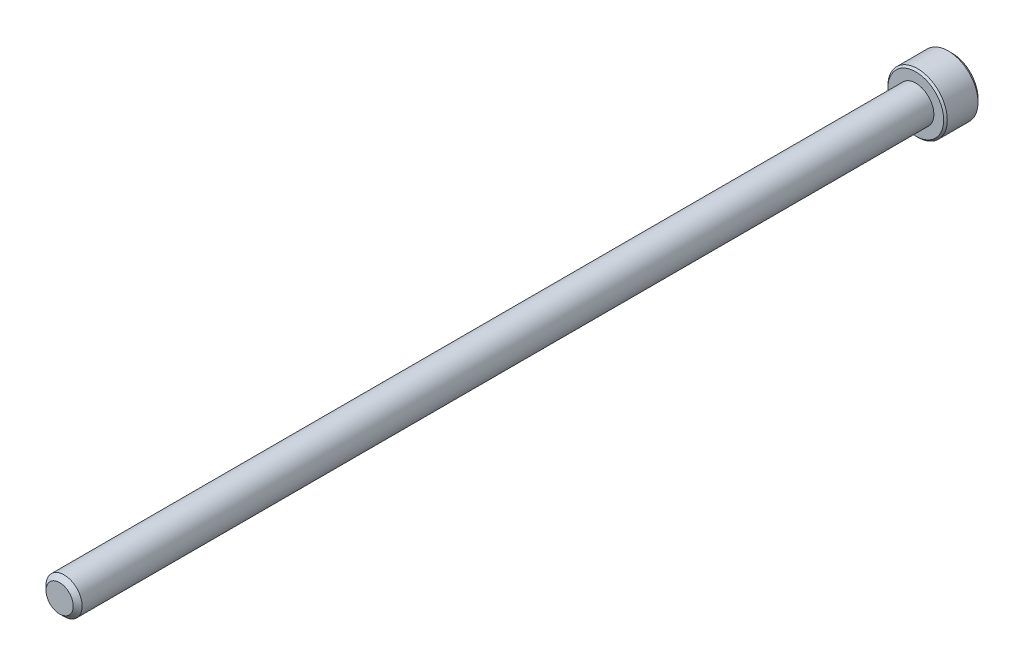
ISO-10303-21;
HEADER;
FILE_DESCRIPTION(('STEP AP214'),'2;1');
FILE_NAME('part.step','',(''),(''),'','','');
FILE_SCHEMA(('AUTOMOTIVE_DESIGN { 1 0 10303 214 1 1 1 1 }'));
ENDSEC;
DATA;
#1=APPLICATION_CONTEXT('core data for automotive mechanical design processes');
#2=APPLICATION_PROTOCOL_DEFINITION('international standard','automotive_design',2000,#1);
#3=PRODUCT_CONTEXT('',#1,'mechanical');
#4=PRODUCT('Part','Part','',(#3));
#5=PRODUCT_RELATED_PRODUCT_CATEGORY('part','',(#4));
#6=PRODUCT_DEFINITION_FORMATION('','',#4);
#7=PRODUCT_DEFINITION_CONTEXT('part definition',#1,'design');
#8=PRODUCT_DEFINITION('design','',#6,#7);
#9=PRODUCT_DEFINITION_SHAPE('','',#8);
#10=(LENGTH_UNIT() NAMED_UNIT(*) SI_UNIT(.MILLI.,.METRE.));
#11=(NAMED_UNIT(*) PLANE_ANGLE_UNIT() SI_UNIT($,.RADIAN.));
#12=(NAMED_UNIT(*) SI_UNIT($,.STERADIAN.) SOLID_ANGLE_UNIT());
#13=UNCERTAINTY_MEASURE_WITH_UNIT(LENGTH_MEASURE(1.E-05),#10,'distance_accuracy_value','');
#14=(GEOMETRIC_REPRESENTATION_CONTEXT(3) GLOBAL_UNCERTAINTY_ASSIGNED_CONTEXT((#13)) GLOBAL_UNIT_ASSIGNED_CONTEXT((#10,
#11,#12)) REPRESENTATION_CONTEXT('',''));
#15=CARTESIAN_POINT('',(0.,0.,0.));
#16=DIRECTION('',(0.,0.,1.));
#17=DIRECTION('',(1.,0.,0.));
#18=AXIS2_PLACEMENT_3D('',#15,#16,#17);
#19=CARTESIAN_POINT('',(-1.984375,-1.14567944042316,-116.1494375));
#20=DIRECTION('',(-1.,0.,0.));
#21=DIRECTION('',(0.,-1.,0.));
#22=AXIS2_PLACEMENT_3D('',#19,#20,#21);
#23=PLANE('',#22);
#24=CARTESIAN_POINT('',(-1.984375,1.14567944041338,-119.126000000011));
#25=CARTESIAN_POINT('',(-1.98437500000024,1.0674388034124,-119.086916183681));
#26=CARTESIAN_POINT('',(-1.98437500000012,0.987898318953982,-119.050114476903));
#27=CARTESIAN_POINT('',(-1.98437499999988,0.825677042049242,-118.982656205058));
#28=CARTESIAN_POINT('',(-1.98437499999976,0.742979382563747,-118.952040560663));
#29=CARTESIAN_POINT('',(-1.98437500000024,0.575193959619517,-118.899173922878));
#30=CARTESIAN_POINT('',(-1.98437500000084,0.490115359195776,-118.876894620852));
#31=CARTESIAN_POINT('',(-1.98437499999917,0.318093091238021,-118.842594672255));
#32=CARTESIAN_POINT('',(-1.98437499999691,0.231156055098932,-118.830542302321));
#33=CARTESIAN_POINT('',(-1.98437500000085,0.119918521624664,-118.822491102659));
#34=CARTESIAN_POINT('',(-1.9843750000021,0.0959468443956495,-118.821189475593));
#35=CARTESIAN_POINT('',(-1.9843749999979,0.0479845644867519,-118.819451826315));
#36=CARTESIAN_POINT('',(-1.98437499999245,0.0239939791817175,-118.81901533388));
#37=CARTESIAN_POINT('',(-1.98437499998354,-0.0602201717362284,-118.819018090105));
#38=CARTESIAN_POINT('',(-1.98437499999549,-0.120461721886413,-118.821774523015));
#39=CARTESIAN_POINT('',(-1.98437500000451,-0.240474970950748,-118.83263655126));
#40=CARTESIAN_POINT('',(-1.98437500000157,-0.300246312710092,-118.840745877508));
#41=CARTESIAN_POINT('',(-1.98437499999685,-0.478763752726255,-118.872596229478));
#42=CARTESIAN_POINT('',(-1.98437499999927,-0.596208828840069,-118.90385422612));
#43=CARTESIAN_POINT('',(-1.98437500000048,-0.78592148733947,-118.967800035926));
#44=CARTESIAN_POINT('',(-1.98437500000024,-0.859734609779649,-118.996234577698));
#45=CARTESIAN_POINT('',(-1.98437499999977,-1.00456595513328,-119.05786140404));
#46=CARTESIAN_POINT('',(-1.98437499999953,-1.07560356652465,-119.091007793046));
#47=CARTESIAN_POINT('',(-1.984375,-1.14567944041337,-119.126000000011));
#48=B_SPLINE_CURVE_WITH_KNOTS('',3,(#24,#25,#26,#27,#28,#29,#30,#31,#32,#33,#34,#35,#36,#37,#38,
#39,#40,#41,#42,#43,#44,#45,#46,#47),.UNSPECIFIED.,.F.,.F.,(4,2,2,2,2,2,2,2,2,2,2,4),(0.,
0.26255900517064,0.526801735763274,0.790138824289467,1.05265603846137,1.1246661917328,
1.1966371949705,1.37727026721659,1.55802937201545,1.92104085076478,2.15819130083342,
2.39317265074609),.UNSPECIFIED.);
#49=CARTESIAN_POINT('',(-1.98437499999081,1.14567944041786,-119.126000000005));
#50=VERTEX_POINT('',#49);
#51=CARTESIAN_POINT('',(-1.98437499999081,-1.14567944041786,-119.126000000005));
#52=VERTEX_POINT('',#51);
#53=EDGE_CURVE('E21',#50,#52,#48,.T.);
#54=ORIENTED_EDGE('',*,*,#53,.F.);
#55=DIRECTION('',(0.,0.,1.));
#56=VECTOR('',#55,1.);
#57=CARTESIAN_POINT('',(-1.984375,1.14567944042316,-116.1494375));
#58=LINE('',#57,#56);
#59=CARTESIAN_POINT('',(-1.984375,1.14567944042316,-116.1494375));
#60=VERTEX_POINT('',#59);
#61=EDGE_CURVE('E65',#50,#60,#58,.T.);
#62=ORIENTED_EDGE('',*,*,#61,.T.);
#63=DIRECTION('',(0.,1.,0.));
#64=VECTOR('',#63,1.);
#65=CARTESIAN_POINT('',(-1.984375,3.43703832126949,-116.1494375));
#66=LINE('',#65,#64);
#67=CARTESIAN_POINT('',(-1.984375,-1.14567944042316,-116.1494375));
#68=VERTEX_POINT('',#67);
#69=EDGE_CURVE('E70',#68,#60,#66,.T.);
#70=ORIENTED_EDGE('',*,*,#69,.F.);
#71=DIRECTION('',(0.,0.,1.));
#72=VECTOR('',#71,1.);
#73=CARTESIAN_POINT('',(-1.984375,-1.14567944042316,-116.1494375));
#74=LINE('',#73,#72);
#75=EDGE_CURVE('E68',#68,#52,#74,.F.);
#76=ORIENTED_EDGE('',*,*,#75,.T.);
#77=EDGE_LOOP('',(#54,#62,#70,#76));
#78=FACE_BOUND('',#77,.T.);
#79=ADVANCED_FACE('F17',(#78),#23,.F.);
#80=CARTESIAN_POINT('',(1.984375,3.43703832126949,-116.1494375));
#81=DIRECTION('',(0.,0.,-1.));
#82=DIRECTION('',(-1.,0.,0.));
#83=AXIS2_PLACEMENT_3D('',#80,#81,#82);
#84=PLANE('',#83);
#85=DIRECTION('',(0.866025403784439,-0.5,0.));
#86=VECTOR('',#85,1.);
#87=CARTESIAN_POINT('',(0.,-2.29135888084633,-116.1494375));
#88=LINE('',#87,#86);
#89=CARTESIAN_POINT('',(0.,-2.29135888084633,-116.1494375));
#90=VERTEX_POINT('',#89);
#91=EDGE_CURVE('E88',#90,#68,#88,.F.);
#92=ORIENTED_EDGE('',*,*,#91,.T.);
#93=ORIENTED_EDGE('',*,*,#69,.T.);
#94=DIRECTION('',(-0.866025403784439,-0.5,0.));
#95=VECTOR('',#94,1.);
#96=CARTESIAN_POINT('',(-1.984375,1.14567944042316,-116.1494375));
#97=LINE('',#96,#95);
#98=CARTESIAN_POINT('',(0.,2.29135888084633,-116.1494375));
#99=VERTEX_POINT('',#98);
#100=EDGE_CURVE('E87',#60,#99,#97,.F.);
#101=ORIENTED_EDGE('',*,*,#100,.T.);
#102=DIRECTION('',(-0.866025403784439,0.5,0.));
#103=VECTOR('',#102,1.);
#104=CARTESIAN_POINT('',(0.,2.29135888084633,-116.1494375));
#105=LINE('',#104,#103);
#106=CARTESIAN_POINT('',(1.984375,1.14567944042316,-116.1494375));
#107=VERTEX_POINT('',#106);
#108=EDGE_CURVE('E228',#99,#107,#105,.F.);
#109=ORIENTED_EDGE('',*,*,#108,.T.);
#110=DIRECTION('',(0.,1.,0.));
#111=VECTOR('',#110,1.);
#112=CARTESIAN_POINT('',(1.984375,1.14567944042316,-116.1494375));
#113=LINE('',#112,#111);
#114=CARTESIAN_POINT('',(1.984375,-1.14567944042316,-116.1494375));
#115=VERTEX_POINT('',#114);
#116=EDGE_CURVE('E233',#107,#115,#113,.F.);
#117=ORIENTED_EDGE('',*,*,#116,.T.);
#118=DIRECTION('',(0.866025403784439,0.5,0.));
#119=VECTOR('',#118,1.);
#120=CARTESIAN_POINT('',(1.984375,-1.14567944042316,-116.1494375));
#121=LINE('',#120,#119);
#122=EDGE_CURVE('E238',#115,#90,#121,.F.);
#123=ORIENTED_EDGE('',*,*,#122,.T.);
#124=EDGE_LOOP('',(#92,#93,#101,#109,#117,#123));
#125=FACE_BOUND('',#124,.T.);
#126=ADVANCED_FACE('F164',(#125),#84,.T.);
#127=CARTESIAN_POINT('',(-1.984375,1.14567944042316,-116.1494375));
#128=DIRECTION('',(-0.5,0.866025403784439,0.));
#129=DIRECTION('',(-0.866025403784439,-0.5,0.));
#130=AXIS2_PLACEMENT_3D('',#127,#128,#129);
#131=PLANE('',#130);
#132=CARTESIAN_POINT('',(-1.98437499999152,1.14567944042806,-119.126000000011));
#133=CARTESIAN_POINT('',(-1.91617106211821,1.18505700231901,-119.086660227985));
#134=CARTESIAN_POINT('',(-1.8468267530037,1.22509295785304,-119.049631328498));
#135=CARTESIAN_POINT('',(-1.70542659044986,1.30673037976695,-118.981832994311));
#136=CARTESIAN_POINT('',(-1.63335729719551,1.34833960562766,-118.951101270255));
#137=CARTESIAN_POINT('',(-1.48803310241476,1.43224256860409,-118.898457620171));
#138=CARTESIAN_POINT('',(-1.41481519063102,1.47451494968193,-118.876413412026));
#139=CARTESIAN_POINT('',(-1.26676792252624,1.55999007977502,-118.842450110744));
#140=CARTESIAN_POINT('',(-1.19194308558497,1.60319021952513,-118.83050567479));
#141=CARTESIAN_POINT('',(-1.0629790320441,1.67764765055274,-118.819728427594));
#142=CARTESIAN_POINT('',(-1.00900630840282,1.70880881707593,-118.818133528019));
#143=CARTESIAN_POINT('',(-0.901149169207102,1.7710801654246,-118.820823921458));
#144=CARTESIAN_POINT('',(-0.84726479123212,1.80219032555357,-118.825111275531));
#145=CARTESIAN_POINT('',(-0.74000492018226,1.86411684097745,-118.839322194288));
#146=CARTESIAN_POINT('',(-0.686630064022277,1.89493282854938,-118.84925206053));
#147=CARTESIAN_POINT('',(-0.580803363121271,1.95603190280202,-118.87420294852));
#148=CARTESIAN_POINT('',(-0.528351447917159,1.98631503016463,-118.889223579817));
#149=CARTESIAN_POINT('',(-0.394030915896095,2.06386502548468,-118.933804789076));
#150=CARTESIAN_POINT('',(-0.312994309049164,2.11065153226197,-118.96672213391));
#151=CARTESIAN_POINT('',(-0.193836207793494,2.17944749409806,-119.022289520453));
#152=CARTESIAN_POINT('',(-0.154568167005747,2.20211890801741,-119.041813093821));
#153=CARTESIAN_POINT('',(-0.0767591723958253,2.24704195200082,-119.082639700717));
#154=CARTESIAN_POINT('',(-0.0382177904819875,2.26929382922372,-119.103941643687));
#155=CARTESIAN_POINT('',(-9.51631212581947E-12,2.29135888084083,-119.12600000001));
#156=B_SPLINE_CURVE_WITH_KNOTS('',3,(#132,#133,#134,#135,#136,#137,#138,#139,#140,#141,#142,
#143,#144,#145,#146,#147,#148,#149,#150,#151,#152,#153,#154,#155),.UNSPECIFIED.,.F.,.F.,(4,2,2,
2,2,2,2,2,2,2,2,4),(0.,0.264284909618714,0.53010899634244,0.791712695391101,1.05265800171368,
1.23942150113653,1.42625045660794,1.61328847391115,1.80031214905581,2.09727151177324,
2.24534838939361,2.39333511883005),.UNSPECIFIED.);
#157=CARTESIAN_POINT('',(1.36186991098129E-11,2.29135888083297,-119.126000000002));
#158=VERTEX_POINT('',#157);
#159=EDGE_CURVE('E84',#50,#158,#156,.T.);
#160=ORIENTED_EDGE('',*,*,#159,.T.);
#161=DIRECTION('',(0.,0.,1.));
#162=VECTOR('',#161,1.);
#163=CARTESIAN_POINT('',(0.,2.29135888084633,-116.1494375));
#164=LINE('',#163,#162);
#165=EDGE_CURVE('E95',#158,#99,#164,.T.);
#166=ORIENTED_EDGE('',*,*,#165,.T.);
#167=ORIENTED_EDGE('',*,*,#100,.F.);
#168=ORIENTED_EDGE('',*,*,#61,.F.);
#169=EDGE_LOOP('',(#160,#166,#167,#168));
#170=FACE_BOUND('',#169,.T.);
#171=ADVANCED_FACE('F82',(#170),#131,.F.);
#172=CARTESIAN_POINT('',(0.,-2.29135888084633,-116.1494375));
#173=DIRECTION('',(-0.5,-0.866025403784439,0.));
#174=DIRECTION('',(0.866025403784439,-0.5,0.));
#175=AXIS2_PLACEMENT_3D('',#172,#173,#174);
#176=PLANE('',#175);
#177=CARTESIAN_POINT('',(-9.52353801629142E-12,-2.29135888084083,-119.12600000001));
#178=CARTESIAN_POINT('',(-0.068203937882774,-2.25198131894992,-119.086660227984));
#179=CARTESIAN_POINT('',(-0.137548246997219,-2.21194536341592,-119.049631328498));
#180=CARTESIAN_POINT('',(-0.278948409550927,-2.13030794150208,-118.981832994311));
#181=CARTESIAN_POINT('',(-0.351017702805211,-2.08869871564141,-118.951101270255));
#182=CARTESIAN_POINT('',(-0.496341897585819,-2.00479575266507,-118.898457620171));
#183=CARTESIAN_POINT('',(-0.569559809369482,-1.96252337158727,-118.876413412026));
#184=CARTESIAN_POINT('',(-0.717607077474107,-1.87704824149427,-118.842450110743));
#185=CARTESIAN_POINT('',(-0.792431914415305,-1.8338481017442,-118.83050567479));
#186=CARTESIAN_POINT('',(-0.92139596795609,-1.75939067071664,-118.819728427594));
#187=CARTESIAN_POINT('',(-0.975368691597359,-1.72822950419346,-118.818133528019));
#188=CARTESIAN_POINT('',(-1.08322583079307,-1.66595815584479,-118.820823921458));
#189=CARTESIAN_POINT('',(-1.13711020876805,-1.63484799571582,-118.825111275531));
#190=CARTESIAN_POINT('',(-1.2443700798179,-1.57292148029194,-118.839322194288));
#191=CARTESIAN_POINT('',(-1.29774493597788,-1.54210549272002,-118.84925206053));
#192=CARTESIAN_POINT('',(-1.40357163687888,-1.48100641846738,-118.87420294852));
#193=CARTESIAN_POINT('',(-1.45602355208299,-1.45072329110478,-118.889223579817));
#194=CARTESIAN_POINT('',(-1.59034408410421,-1.37317329578463,-118.933804789076));
#195=CARTESIAN_POINT('',(-1.6713806909513,-1.32638678900725,-118.96672213391));
#196=CARTESIAN_POINT('',(-1.79053879220719,-1.25759082717104,-119.022289520454));
#197=CARTESIAN_POINT('',(-1.82980683299501,-1.23491941325165,-119.041813093821));
#198=CARTESIAN_POINT('',(-1.90761582760507,-1.18999636926815,-119.082639700718));
#199=CARTESIAN_POINT('',(-1.94615720951898,-1.16774449204521,-119.103941643688));
#200=CARTESIAN_POINT('',(-1.98437499999152,-1.14567944042806,-119.126000000011));
#201=B_SPLINE_CURVE_WITH_KNOTS('',3,(#177,#178,#179,#180,#181,#182,#183,#184,#185,#186,#187,
#188,#189,#190,#191,#192,#193,#194,#195,#196,#197,#198,#199,#200),.UNSPECIFIED.,.F.,.F.,(4,2,2,
2,2,2,2,2,2,2,2,4),(0.,0.264284909618431,0.530108996341872,0.791712695390248,1.05265800171255,
1.23942150113538,1.42625045660678,1.61328847390998,1.80031214905463,2.09727151177264,
2.2453483893933,2.39333511883004),.UNSPECIFIED.);
#202=CARTESIAN_POINT('',(0.,-2.29135888083571,-119.126000000005));
#203=VERTEX_POINT('',#202);
#204=EDGE_CURVE('E94',#203,#52,#201,.T.);
#205=ORIENTED_EDGE('',*,*,#204,.T.);
#206=ORIENTED_EDGE('',*,*,#75,.F.);
#207=ORIENTED_EDGE('',*,*,#91,.F.);
#208=DIRECTION('',(0.,0.,1.));
#209=VECTOR('',#208,1.);
#210=CARTESIAN_POINT('',(0.,-2.29135888084633,-116.1494375));
#211=LINE('',#210,#209);
#212=EDGE_CURVE('E236',#90,#203,#211,.F.);
#213=ORIENTED_EDGE('',*,*,#212,.T.);
#214=EDGE_LOOP('',(#205,#206,#207,#213));
#215=FACE_BOUND('',#214,.T.);
#216=ADVANCED_FACE('F155',(#215),#176,.F.);
#217=CARTESIAN_POINT('',(1.984375,-1.14567944042316,-116.1494375));
#218=DIRECTION('',(0.5,-0.866025403784439,0.));
#219=DIRECTION('',(0.866025403784439,0.5,0.));
#220=AXIS2_PLACEMENT_3D('',#217,#218,#219);
#221=PLANE('',#220);
#222=CARTESIAN_POINT('',(1.98437499999048,-1.14567944042866,-119.12600000001));
#223=CARTESIAN_POINT('',(1.91617106211723,-1.18505700231957,-119.086660227984));
#224=CARTESIAN_POINT('',(1.84682675300278,-1.22509295785357,-119.049631328498));
#225=CARTESIAN_POINT('',(1.70542659044908,-1.30673037976741,-118.981832994311));
#226=CARTESIAN_POINT('',(1.63335729719479,-1.34833960562807,-118.951101270255));
#227=CARTESIAN_POINT('',(1.48803310241418,-1.43224256860442,-118.898457620171));
#228=CARTESIAN_POINT('',(1.41481519063052,-1.47451494968222,-118.876413412026));
#229=CARTESIAN_POINT('',(1.26676792252589,-1.55999007977522,-118.842450110743));
#230=CARTESIAN_POINT('',(1.19194308558469,-1.60319021952529,-118.83050567479));
#231=CARTESIAN_POINT('',(1.06297903204391,-1.67764765055285,-118.819728427594));
#232=CARTESIAN_POINT('',(1.00900630840264,-1.70880881707603,-118.818133528019));
#233=CARTESIAN_POINT('',(0.901149169206922,-1.7710801654247,-118.820823921458));
#234=CARTESIAN_POINT('',(0.847264791231944,-1.80219032555367,-118.825111275531));
#235=CARTESIAN_POINT('',(0.740004920182092,-1.86411684097755,-118.839322194288));
#236=CARTESIAN_POINT('',(0.686630064022114,-1.89493282854947,-118.84925206053));
#237=CARTESIAN_POINT('',(0.580803363121118,-1.95603190280211,-118.87420294852));
#238=CARTESIAN_POINT('',(0.52835144791701,-1.98631503016471,-118.889223579817));
#239=CARTESIAN_POINT('',(0.394030915895975,-2.06386502548475,-118.933804789076));
#240=CARTESIAN_POINT('',(0.31299430904907,-2.11065153226203,-118.96672213391));
#241=CARTESIAN_POINT('',(0.19383620779344,-2.17944749409809,-119.022289520453));
#242=CARTESIAN_POINT('',(0.154568167005707,-2.20211890801744,-119.041813093821));
#243=CARTESIAN_POINT('',(0.0767591723958095,-2.24704195200083,-119.082639700717));
#244=CARTESIAN_POINT('',(0.0382177904819819,-2.26929382922372,-119.103941643687));
#245=CARTESIAN_POINT('',(9.52058922518447E-12,-2.29135888084083,-119.12600000001));
#246=B_SPLINE_CURVE_WITH_KNOTS('',3,(#222,#223,#224,#225,#226,#227,#228,#229,#230,#231,#232,
#233,#234,#235,#236,#237,#238,#239,#240,#241,#242,#243,#244,#245),.UNSPECIFIED.,.F.,.F.,(4,2,2,
2,2,2,2,2,2,2,2,4),(0.,0.264284909618429,0.530108996341869,0.791712695390248,1.05265800171255,
1.23942150113539,1.42625045660679,1.61328847390999,1.80031214905464,2.09727151177198,
2.24534838939229,2.3933351188287),.UNSPECIFIED.);
#247=CARTESIAN_POINT('',(1.98437499999081,-1.14567944041786,-119.126000000005));
#248=VERTEX_POINT('',#247);
#249=EDGE_CURVE('E140',#248,#203,#246,.T.);
#250=ORIENTED_EDGE('',*,*,#249,.T.);
#251=ORIENTED_EDGE('',*,*,#212,.F.);
#252=ORIENTED_EDGE('',*,*,#122,.F.);
#253=DIRECTION('',(0.,0.,-1.));
#254=VECTOR('',#253,1.);
#255=CARTESIAN_POINT('',(1.984375,-1.14567944042316,-116.1494375));
#256=LINE('',#255,#254);
#257=EDGE_CURVE('E231',#115,#248,#256,.T.);
#258=ORIENTED_EDGE('',*,*,#257,.T.);
#259=EDGE_LOOP('',(#250,#251,#252,#258));
#260=FACE_BOUND('',#259,.T.);
#261=ADVANCED_FACE('F151',(#260),#221,.F.);
#262=CARTESIAN_POINT('',(1.984375,1.14567944042316,-116.1494375));
#263=DIRECTION('',(1.,0.,0.));
#264=DIRECTION('',(0.,0.,-1.));
#265=AXIS2_PLACEMENT_3D('',#262,#263,#264);
#266=PLANE('',#265);
#267=CARTESIAN_POINT('',(1.984375,1.14567944041217,-119.12600000001));
#268=CARTESIAN_POINT('',(1.984375,1.06692431663035,-119.086660227984));
#269=CARTESIAN_POINT('',(1.984375,0.986852405562356,-119.049631328498));
#270=CARTESIAN_POINT('',(1.984375,0.823577561734674,-118.981832994311));
#271=CARTESIAN_POINT('',(1.984375,0.74035911001334,-118.951101270255));
#272=CARTESIAN_POINT('',(1.984375,0.572553184060641,-118.898457620171));
#273=CARTESIAN_POINT('',(1.984375,0.48800842190504,-118.876413412026));
#274=CARTESIAN_POINT('',(1.984375,0.317058161719049,-118.842450110743));
#275=CARTESIAN_POINT('',(1.984375,0.230657882218906,-118.83050567479));
#276=CARTESIAN_POINT('',(1.984375,0.0817430201637877,-118.819728427594));
#277=CARTESIAN_POINT('',(1.984375,0.0194206871174187,-118.818133528019));
#278=CARTESIAN_POINT('',(1.984375,-0.10512200957992,-118.820823921458));
#279=CARTESIAN_POINT('',(1.984375,-0.167342329837858,-118.825111275531));
#280=CARTESIAN_POINT('',(1.984375,-0.291195360685612,-118.839322194288));
#281=CARTESIAN_POINT('',(1.984375,-0.352827335829455,-118.84925206053));
#282=CARTESIAN_POINT('',(1.984375,-0.475025484334736,-118.87420294852));
#283=CARTESIAN_POINT('',(1.984375,-0.535591739059941,-118.889223579817));
#284=CARTESIAN_POINT('',(1.984375,-0.690691729700012,-118.933804789076));
#285=CARTESIAN_POINT('',(1.984375,-0.784264743254559,-118.96672213391));
#286=CARTESIAN_POINT('',(1.984375,-0.921856666926684,-119.022289520453));
#287=CARTESIAN_POINT('',(1.984375,-0.967199494765377,-119.041813093821));
#288=CARTESIAN_POINT('',(1.984375,-1.05704558273217,-119.082639700717));
#289=CARTESIAN_POINT('',(1.984375,-1.10154933717795,-119.103941643687));
#290=CARTESIAN_POINT('',(1.984375,-1.14567944041217,-119.12600000001));
#291=B_SPLINE_CURVE_WITH_KNOTS('',3,(#267,#268,#269,#270,#271,#272,#273,#274,#275,#276,#277,
#278,#279,#280,#281,#282,#283,#284,#285,#286,#287,#288,#289,#290),.UNSPECIFIED.,.F.,.F.,(4,2,2,
2,2,2,2,2,2,2,2,4),(0.,0.264284909618436,0.530108996341869,0.791712695390249,1.05265800171255,
1.23942150113539,1.42625045660679,1.61328847391,1.80031214905464,2.09727151177198,
2.24534838939228,2.3933351188287),.UNSPECIFIED.);
#292=CARTESIAN_POINT('',(1.98437499999081,1.14567944041786,-119.126000000005));
#293=VERTEX_POINT('',#292);
#294=EDGE_CURVE('E104',#293,#248,#291,.T.);
#295=ORIENTED_EDGE('',*,*,#294,.T.);
#296=ORIENTED_EDGE('',*,*,#257,.F.);
#297=ORIENTED_EDGE('',*,*,#116,.F.);
#298=DIRECTION('',(0.,0.,1.));
#299=VECTOR('',#298,1.);
#300=CARTESIAN_POINT('',(1.984375,1.14567944042316,-116.1494375));
#301=LINE('',#300,#299);
#302=EDGE_CURVE('E40',#107,#293,#301,.F.);
#303=ORIENTED_EDGE('',*,*,#302,.T.);
#304=EDGE_LOOP('',(#295,#296,#297,#303));
#305=FACE_BOUND('',#304,.T.);
#306=ADVANCED_FACE('F154',(#305),#266,.F.);
#307=CARTESIAN_POINT('',(0.,2.29135888084633,-116.1494375));
#308=DIRECTION('',(0.5,0.866025403784439,0.));
#309=DIRECTION('',(-0.866025403784439,0.5,0.));
#310=AXIS2_PLACEMENT_3D('',#307,#308,#309);
#311=PLANE('',#310);
#312=CARTESIAN_POINT('',(9.51721273748671E-12,2.29135888084083,-119.12600000001));
#313=CARTESIAN_POINT('',(0.0682039378827693,2.25198131894992,-119.086660227984));
#314=CARTESIAN_POINT('',(0.137548246997216,2.21194536341592,-119.049631328498));
#315=CARTESIAN_POINT('',(0.278948409550926,2.13030794150208,-118.981832994311));
#316=CARTESIAN_POINT('',(0.351017702805212,2.08869871564141,-118.951101270255));
#317=CARTESIAN_POINT('',(0.496341897585821,2.00479575266506,-118.898457620171));
#318=CARTESIAN_POINT('',(0.569559809369484,1.96252337158726,-118.876413412026));
#319=CARTESIAN_POINT('',(0.717607077474111,1.87704824149427,-118.842450110743));
#320=CARTESIAN_POINT('',(0.79243191441531,1.8338481017442,-118.83050567479));
#321=CARTESIAN_POINT('',(0.921395967956096,1.75939067071664,-118.819728427594));
#322=CARTESIAN_POINT('',(0.975368691597365,1.72822950419346,-118.818133528019));
#323=CARTESIAN_POINT('',(1.08322583079308,1.66595815584479,-118.820823921458));
#324=CARTESIAN_POINT('',(1.13711020876806,1.63484799571582,-118.825111275531));
#325=CARTESIAN_POINT('',(1.24437007981791,1.57292148029194,-118.839322194288));
#326=CARTESIAN_POINT('',(1.29774493597789,1.54210549272002,-118.84925206053));
#327=CARTESIAN_POINT('',(1.40357163687889,1.48100641846738,-118.87420294852));
#328=CARTESIAN_POINT('',(1.456023552083,1.45072329110477,-118.889223579817));
#329=CARTESIAN_POINT('',(1.59034408410403,1.37317329578474,-118.933804789076));
#330=CARTESIAN_POINT('',(1.67138069095093,1.32638678900746,-118.96672213391));
#331=CARTESIAN_POINT('',(1.79053879220656,1.2575908271714,-119.022289520453));
#332=CARTESIAN_POINT('',(1.82980683299429,1.23491941325206,-119.041813093821));
#333=CARTESIAN_POINT('',(1.90761582760419,1.18999636926866,-119.082639700717));
#334=CARTESIAN_POINT('',(1.94615720951802,1.16774449204577,-119.103941643687));
#335=CARTESIAN_POINT('',(1.98437499999048,1.14567944042866,-119.12600000001));
#336=B_SPLINE_CURVE_WITH_KNOTS('',3,(#312,#313,#314,#315,#316,#317,#318,#319,#320,#321,#322,
#323,#324,#325,#326,#327,#328,#329,#330,#331,#332,#333,#334,#335),.UNSPECIFIED.,.F.,.F.,(4,2,2,
2,2,2,2,2,2,2,2,4),(0.,0.264284909618436,0.530108996341879,0.791712695390259,1.05265800171256,
1.23942150113539,1.4262504566068,1.61328847391001,1.80031214905465,2.09727151177199,
2.24534838939229,2.3933351188287),.UNSPECIFIED.);
#337=EDGE_CURVE('E102',#158,#293,#336,.T.);
#338=ORIENTED_EDGE('',*,*,#337,.T.);
#339=ORIENTED_EDGE('',*,*,#302,.F.);
#340=ORIENTED_EDGE('',*,*,#108,.F.);
#341=ORIENTED_EDGE('',*,*,#165,.F.);
#342=EDGE_LOOP('',(#338,#339,#340,#341));
#343=FACE_BOUND('',#342,.T.);
#344=ADVANCED_FACE('F119',(#343),#311,.F.);
#345=CARTESIAN_POINT('',(0.,0.,-119.125999999937));
#346=DIRECTION('',(0.,0.,-1.));
#347=DIRECTION('',(0.,1.,0.));
#348=AXIS2_PLACEMENT_3D('',#345,#346,#347);
#349=CONICAL_SURFACE('',#348,2.29135888076826,0.785398163397448);
#350=ORIENTED_EDGE('',*,*,#159,.F.);
#351=CARTESIAN_POINT('',(0.,0.,-119.125999999994));
#352=DIRECTION('',(0.,0.,-1.));
#353=DIRECTION('',(0.,1.,0.));
#354=AXIS2_PLACEMENT_3D('',#351,#352,#353);
#355=CIRCLE('',#354,2.29135888082511);
#356=EDGE_CURVE('E78',#158,#50,#355,.F.);
#357=ORIENTED_EDGE('',*,*,#356,.F.);
#358=EDGE_LOOP('',(#350,#357));
#359=FACE_BOUND('',#358,.T.);
#360=ADVANCED_FACE('F92',(#359),#349,.F.);
#361=CARTESIAN_POINT('',(0.,0.,-119.125999999937));
#362=DIRECTION('',(0.,0.,-1.));
#363=DIRECTION('',(0.,1.,0.));
#364=AXIS2_PLACEMENT_3D('',#361,#362,#363);
#365=CONICAL_SURFACE('',#364,2.29135888076826,0.785398163397448);
#366=ORIENTED_EDGE('',*,*,#53,.T.);
#367=CARTESIAN_POINT('',(0.,0.,-119.125999999994));
#368=DIRECTION('',(0.,0.,-1.));
#369=DIRECTION('',(0.,1.,0.));
#370=AXIS2_PLACEMENT_3D('',#367,#368,#369);
#371=CIRCLE('',#370,2.2913588808251);
#372=EDGE_CURVE('E72',#50,#52,#371,.F.);
#373=ORIENTED_EDGE('',*,*,#372,.F.);
#374=EDGE_LOOP('',(#366,#373));
#375=FACE_BOUND('',#374,.T.);
#376=ADVANCED_FACE('F73',(#375),#365,.F.);
#377=CARTESIAN_POINT('',(0.,0.,-119.125999999937));
#378=DIRECTION('',(0.,0.,-1.));
#379=DIRECTION('',(0.,1.,0.));
#380=AXIS2_PLACEMENT_3D('',#377,#378,#379);
#381=CONICAL_SURFACE('',#380,2.29135888076826,0.785398163397448);
#382=ORIENTED_EDGE('',*,*,#204,.F.);
#383=CARTESIAN_POINT('',(0.,0.,-119.125999999994));
#384=DIRECTION('',(0.,0.,-1.));
#385=DIRECTION('',(0.,1.,0.));
#386=AXIS2_PLACEMENT_3D('',#383,#384,#385);
#387=CIRCLE('',#386,2.2913588808251);
#388=EDGE_CURVE('E77',#52,#203,#387,.F.);
#389=ORIENTED_EDGE('',*,*,#388,.F.);
#390=EDGE_LOOP('',(#382,#389));
#391=FACE_BOUND('',#390,.T.);
#392=ADVANCED_FACE('F137',(#391),#381,.F.);
#393=CARTESIAN_POINT('',(0.,0.,-119.125999999937));
#394=DIRECTION('',(0.,0.,-1.));
#395=DIRECTION('',(0.,1.,0.));
#396=AXIS2_PLACEMENT_3D('',#393,#394,#395);
#397=CONICAL_SURFACE('',#396,2.29135888076826,0.785398163397448);
#398=ORIENTED_EDGE('',*,*,#249,.F.);
#399=CARTESIAN_POINT('',(0.,0.,-119.125999999994));
#400=DIRECTION('',(0.,0.,-1.));
#401=DIRECTION('',(0.,1.,0.));
#402=AXIS2_PLACEMENT_3D('',#399,#400,#401);
#403=CIRCLE('',#402,2.29135888082509);
#404=EDGE_CURVE('E279',#203,#248,#403,.F.);
#405=ORIENTED_EDGE('',*,*,#404,.F.);
#406=EDGE_LOOP('',(#398,#405));
#407=FACE_BOUND('',#406,.T.);
#408=ADVANCED_FACE('F132',(#407),#397,.F.);
#409=CARTESIAN_POINT('',(0.,0.,-119.125999999937));
#410=DIRECTION('',(0.,0.,-1.));
#411=DIRECTION('',(0.,1.,0.));
#412=AXIS2_PLACEMENT_3D('',#409,#410,#411);
#413=CONICAL_SURFACE('',#412,2.29135888076826,0.785398163397448);
#414=ORIENTED_EDGE('',*,*,#294,.F.);
#415=CARTESIAN_POINT('',(0.,0.,-119.125999999994));
#416=DIRECTION('',(0.,0.,-1.));
#417=DIRECTION('',(0.,1.,0.));
#418=AXIS2_PLACEMENT_3D('',#415,#416,#417);
#419=CIRCLE('',#418,2.2913588808251);
#420=EDGE_CURVE('E277',#248,#293,#419,.F.);
#421=ORIENTED_EDGE('',*,*,#420,.F.);
#422=EDGE_LOOP('',(#414,#421));
#423=FACE_BOUND('',#422,.T.);
#424=ADVANCED_FACE('F126',(#423),#413,.F.);
#425=CARTESIAN_POINT('',(0.,0.,-119.125999999937));
#426=DIRECTION('',(0.,0.,-1.));
#427=DIRECTION('',(0.,1.,0.));
#428=AXIS2_PLACEMENT_3D('',#425,#426,#427);
#429=CONICAL_SURFACE('',#428,2.29135888076826,0.785398163397448);
#430=ORIENTED_EDGE('',*,*,#337,.F.);
#431=CARTESIAN_POINT('',(0.,0.,-119.125999999994));
#432=DIRECTION('',(0.,0.,-1.));
#433=DIRECTION('',(0.,1.,0.));
#434=AXIS2_PLACEMENT_3D('',#431,#432,#433);
#435=CIRCLE('',#434,2.2913588808251);
#436=EDGE_CURVE('E101',#293,#158,#435,.F.);
#437=ORIENTED_EDGE('',*,*,#436,.F.);
#438=EDGE_LOOP('',(#430,#437));
#439=FACE_BOUND('',#438,.T.);
#440=ADVANCED_FACE('F122',(#439),#429,.F.);
#441=CARTESIAN_POINT('',(0.,0.,-119.126));
#442=DIRECTION('',(0.,0.,-1.));
#443=DIRECTION('',(-1.,0.,0.));
#444=AXIS2_PLACEMENT_3D('',#441,#442,#443);
#445=PLANE('',#444);
#446=ORIENTED_EDGE('',*,*,#420,.T.);
#447=ORIENTED_EDGE('',*,*,#436,.T.);
#448=ORIENTED_EDGE('',*,*,#356,.T.);
#449=ORIENTED_EDGE('',*,*,#372,.T.);
#450=ORIENTED_EDGE('',*,*,#388,.T.);
#451=ORIENTED_EDGE('',*,*,#404,.T.);
#452=EDGE_LOOP('',(#446,#447,#448,#449,#450,#451));
#453=FACE_BOUND('',#452,.T.);
#454=CARTESIAN_POINT('',(0.,0.,-119.125999999937));
#455=DIRECTION('',(0.,0.,1.));
#456=DIRECTION('',(1.,0.,0.));
#457=AXIS2_PLACEMENT_3D('',#454,#455,#456);
#458=CIRCLE('',#457,3.4797999999796);
#459=CARTESIAN_POINT('',(3.4797999999796,0.,-119.125999999937));
#460=VERTEX_POINT('',#459);
#461=EDGE_CURVE('E213',#460,#460,#458,.T.);
#462=ORIENTED_EDGE('',*,*,#461,.F.);
#463=EDGE_LOOP('',(#462));
#464=FACE_BOUND('',#463,.T.);
#465=ADVANCED_FACE('F98',(#453,#464),#445,.T.);
#466=CARTESIAN_POINT('',(0.,0.,-118.643400000053));
#467=DIRECTION('',(0.,0.,1.));
#468=DIRECTION('',(1.,0.,0.));
#469=AXIS2_PLACEMENT_3D('',#466,#467,#468);
#470=CONICAL_SURFACE('',#469,3.96239999992076,0.785398163456341);
#471=ORIENTED_EDGE('',*,*,#461,.T.);
#472=EDGE_LOOP('',(#471));
#473=FACE_BOUND('',#472,.T.);
#474=CARTESIAN_POINT('',(0.,0.,-118.6434));
#475=DIRECTION('',(0.,0.,1.));
#476=DIRECTION('',(1.,0.,0.));
#477=AXIS2_PLACEMENT_3D('',#474,#475,#476);
#478=CIRCLE('',#477,3.9624);
#479=CARTESIAN_POINT('',(3.9624,0.,-118.6434));
#480=VERTEX_POINT('',#479);
#481=EDGE_CURVE('E216',#480,#480,#478,.T.);
#482=ORIENTED_EDGE('',*,*,#481,.F.);
#483=EDGE_LOOP('',(#482));
#484=FACE_BOUND('',#483,.T.);
#485=ADVANCED_FACE('F203',(#473,#484),#470,.T.);
#486=CARTESIAN_POINT('',(0.,0.,-119.126));
#487=DIRECTION('',(0.,0.,1.));
#488=DIRECTION('',(1.,0.,0.));
#489=AXIS2_PLACEMENT_3D('',#486,#487,#488);
#490=CYLINDRICAL_SURFACE('',#489,3.9624);
#491=ORIENTED_EDGE('',*,*,#481,.T.);
#492=EDGE_LOOP('',(#491));
#493=FACE_BOUND('',#492,.T.);
#494=CARTESIAN_POINT('',(0.,0.,-114.541300000042));
#495=DIRECTION('',(0.,0.,-1.));
#496=DIRECTION('',(-1.,0.,0.));
#497=AXIS2_PLACEMENT_3D('',#494,#495,#496);
#498=CIRCLE('',#497,3.96239999997761);
#499=CARTESIAN_POINT('',(-3.96239999997761,0.,-114.541300000042));
#500=VERTEX_POINT('',#499);
#501=EDGE_CURVE('E217',#500,#500,#498,.F.);
#502=ORIENTED_EDGE('',*,*,#501,.F.);
#503=EDGE_LOOP('',(#502));
#504=FACE_BOUND('',#503,.T.);
#505=ADVANCED_FACE('F200',(#493,#504),#490,.T.);
#506=CARTESIAN_POINT('',(0.,0.,-114.541299999928));
#507=DIRECTION('',(0.,0.,-1.));
#508=DIRECTION('',(-1.,0.,0.));
#509=AXIS2_PLACEMENT_3D('',#506,#507,#508);
#510=CONICAL_SURFACE('',#509,3.96239999992076,0.785398163397448);
#511=CARTESIAN_POINT('',(0.,0.,-114.300000000014));
#512=DIRECTION('',(0.,0.,-1.));
#513=DIRECTION('',(-1.,0.,0.));
#514=AXIS2_PLACEMENT_3D('',#511,#512,#513);
#515=CIRCLE('',#514,3.72110000000703);
#516=CARTESIAN_POINT('',(-3.72110000000703,0.,-114.300000000014));
#517=VERTEX_POINT('',#516);
#518=EDGE_CURVE('E220',#517,#517,#515,.T.);
#519=ORIENTED_EDGE('',*,*,#518,.T.);
#520=EDGE_LOOP('',(#519));
#521=FACE_BOUND('',#520,.T.);
#522=ORIENTED_EDGE('',*,*,#501,.T.);
#523=EDGE_LOOP('',(#522));
#524=FACE_BOUND('',#523,.T.);
#525=ADVANCED_FACE('F196',(#521,#524),#510,.T.);
#526=CARTESIAN_POINT('',(0.,0.,0.));
#527=DIRECTION('',(0.,0.,1.));
#528=DIRECTION('',(1.,0.,0.));
#529=AXIS2_PLACEMENT_3D('',#526,#527,#528);
#530=PLANE('',#529);
#531=CARTESIAN_POINT('',(0.,0.,5.6843418860808E-11));
#532=DIRECTION('',(0.,0.,-1.));
#533=DIRECTION('',(-1.,0.,0.));
#534=AXIS2_PLACEMENT_3D('',#531,#532,#533);
#535=CIRCLE('',#534,1.81768749996536);
#536=CARTESIAN_POINT('',(-1.81768749996536,0.,5.6843418860808E-11));
#537=VERTEX_POINT('',#536);
#538=EDGE_CURVE('E271',#537,#537,#535,.T.);
#539=ORIENTED_EDGE('',*,*,#538,.F.);
#540=EDGE_LOOP('',(#539));
#541=FACE_BOUND('',#540,.T.);
#542=ADVANCED_FACE('F192',(#541),#530,.T.);
#543=CARTESIAN_POINT('',(0.,0.,-114.3));
#544=DIRECTION('',(0.,0.,-1.));
#545=DIRECTION('',(-1.,0.,0.));
#546=AXIS2_PLACEMENT_3D('',#543,#544,#545);
#547=PLANE('',#546);
#548=CARTESIAN_POINT('',(0.,0.,-114.3));
#549=DIRECTION('',(0.,0.,1.));
#550=DIRECTION('',(1.,0.,0.));
#551=AXIS2_PLACEMENT_3D('',#548,#549,#550);
#552=CIRCLE('',#551,2.413);
#553=CARTESIAN_POINT('',(2.413,0.,-114.3));
#554=VERTEX_POINT('',#553);
#555=EDGE_CURVE('E31',#554,#554,#552,.T.);
#556=ORIENTED_EDGE('',*,*,#555,.F.);
#557=EDGE_LOOP('',(#556));
#558=FACE_BOUND('',#557,.T.);
#559=ORIENTED_EDGE('',*,*,#518,.F.);
#560=EDGE_LOOP('',(#559));
#561=FACE_BOUND('',#560,.T.);
#562=ADVANCED_FACE('F185',(#558,#561),#547,.F.);
#563=CARTESIAN_POINT('',(0.,0.,-0.595312500024647));
#564=DIRECTION('',(0.,0.,-1.));
#565=DIRECTION('',(-1.,0.,0.));
#566=AXIS2_PLACEMENT_3D('',#563,#564,#565);
#567=CONICAL_SURFACE('',#566,2.41300000004685,0.785398163397448);
#568=CARTESIAN_POINT('',(0.,0.,-0.5953125));
#569=DIRECTION('',(0.,0.,1.));
#570=DIRECTION('',(1.,0.,0.));
#571=AXIS2_PLACEMENT_3D('',#568,#569,#570);
#572=CIRCLE('',#571,2.413);
#573=CARTESIAN_POINT('',(2.413,0.,-0.5953125));
#574=VERTEX_POINT('',#573);
#575=EDGE_CURVE('E11',#574,#574,#572,.F.);
#576=ORIENTED_EDGE('',*,*,#575,.F.);
#577=EDGE_LOOP('',(#576));
#578=FACE_BOUND('',#577,.T.);
#579=ORIENTED_EDGE('',*,*,#538,.T.);
#580=EDGE_LOOP('',(#579));
#581=FACE_BOUND('',#580,.T.);
#582=ADVANCED_FACE('F179',(#578,#581),#567,.T.);
#583=CARTESIAN_POINT('',(0.,0.,-114.3));
#584=DIRECTION('',(0.,0.,1.));
#585=DIRECTION('',(1.,0.,0.));
#586=AXIS2_PLACEMENT_3D('',#583,#584,#585);
#587=CYLINDRICAL_SURFACE('',#586,2.413);
#588=ORIENTED_EDGE('',*,*,#575,.T.);
#589=EDGE_LOOP('',(#588));
#590=FACE_BOUND('',#589,.T.);
#591=ORIENTED_EDGE('',*,*,#555,.T.);
#592=EDGE_LOOP('',(#591));
#593=FACE_BOUND('',#592,.T.);
#594=ADVANCED_FACE('F177',(#590,#593),#587,.T.);
#595=CLOSED_SHELL('',(#79,#126,#171,#216,#261,#306,#344,#360,#376,#392,#408,#424,#440,#465,#485,
#505,#525,#542,#562,#582,#594));
#596=MANIFOLD_SOLID_BREP('B1',#595);
#597=ADVANCED_BREP_SHAPE_REPRESENTATION('',(#18,#596),#14);
#598=SHAPE_DEFINITION_REPRESENTATION(#9,#597);
ENDSEC;
END-ISO-10303-21;
